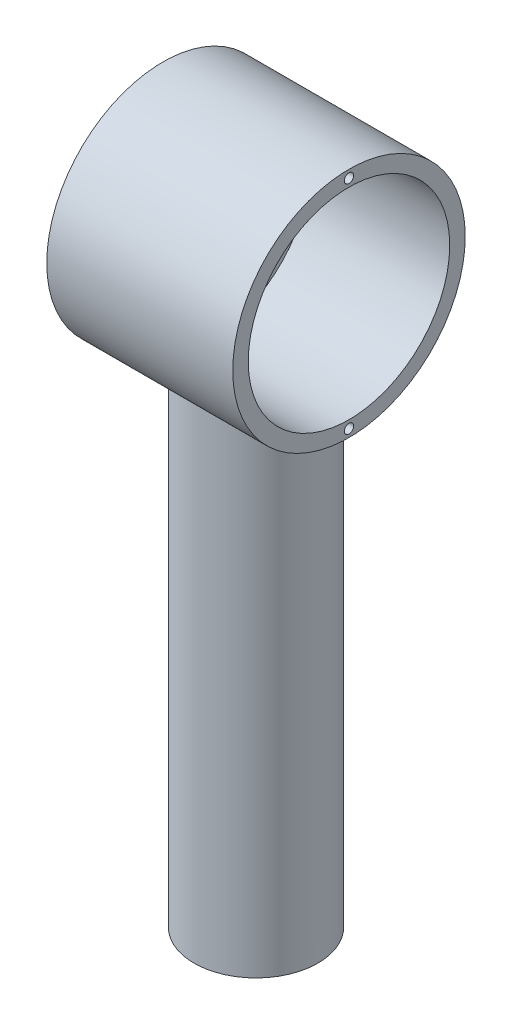
ISO-10303-21;
HEADER;
FILE_DESCRIPTION(('STEP AP214'),'2;1');
FILE_NAME('part.step','',(''),(''),'','','');
FILE_SCHEMA(('AUTOMOTIVE_DESIGN { 1 0 10303 214 1 1 1 1 }'));
ENDSEC;
DATA;
#1=APPLICATION_CONTEXT('core data for automotive mechanical design processes');
#2=APPLICATION_PROTOCOL_DEFINITION('international standard','automotive_design',2000,#1);
#3=PRODUCT_CONTEXT('',#1,'mechanical');
#4=PRODUCT('Part','Part','',(#3));
#5=PRODUCT_RELATED_PRODUCT_CATEGORY('part','',(#4));
#6=PRODUCT_DEFINITION_FORMATION('','',#4);
#7=PRODUCT_DEFINITION_CONTEXT('part definition',#1,'design');
#8=PRODUCT_DEFINITION('design','',#6,#7);
#9=PRODUCT_DEFINITION_SHAPE('','',#8);
#10=(LENGTH_UNIT() NAMED_UNIT(*) SI_UNIT(.MILLI.,.METRE.));
#11=(NAMED_UNIT(*) PLANE_ANGLE_UNIT() SI_UNIT($,.RADIAN.));
#12=(NAMED_UNIT(*) SI_UNIT($,.STERADIAN.) SOLID_ANGLE_UNIT());
#13=UNCERTAINTY_MEASURE_WITH_UNIT(LENGTH_MEASURE(1.E-05),#10,'distance_accuracy_value','');
#14=(GEOMETRIC_REPRESENTATION_CONTEXT(3) GLOBAL_UNCERTAINTY_ASSIGNED_CONTEXT((#13)) GLOBAL_UNIT_ASSIGNED_CONTEXT((#10,
#11,#12)) REPRESENTATION_CONTEXT('',''));
#15=CARTESIAN_POINT('',(0.,0.,0.));
#16=DIRECTION('',(0.,0.,1.));
#17=DIRECTION('',(1.,0.,0.));
#18=AXIS2_PLACEMENT_3D('',#15,#16,#17);
#19=CARTESIAN_POINT('',(30.,39.3347293897193,0.));
#20=DIRECTION('',(-1.,0.,0.));
#21=DIRECTION('',(0.,0.,1.));
#22=AXIS2_PLACEMENT_3D('',#19,#20,#21);
#23=CYLINDRICAL_SURFACE('',#22,37.5);
#24=CARTESIAN_POINT('',(0.,7.61328553859548,-20.));
#25=CARTESIAN_POINT('',(-0.51570182078703,7.6132880699644,-20.0000020694901));
#26=CARTESIAN_POINT('',(-1.03138048086282,7.60066823523603,-19.9800293716016));
#27=CARTESIAN_POINT('',(-2.05864988227541,7.55069636760927,-19.900438433849));
#28=CARTESIAN_POINT('',(-2.57023901293608,7.51333503324412,-19.8408052837619));
#29=CARTESIAN_POINT('',(-3.58588736208425,7.4152585886438,-19.6826321785822));
#30=CARTESIAN_POINT('',(-4.08993349078951,7.35450688776835,-19.5840312579613));
#31=CARTESIAN_POINT('',(-5.08606982289711,7.2119173548362,-19.3492573673804));
#32=CARTESIAN_POINT('',(-5.57816083404603,7.13008095172584,-19.2130869435256));
#33=CARTESIAN_POINT('',(-6.54451950031659,6.94867128669877,-18.9056831081237));
#34=CARTESIAN_POINT('',(-7.01887598033731,6.84920676482473,-18.7346637469901));
#35=CARTESIAN_POINT('',(-7.95042793399519,6.63528396459707,-18.3587310871486));
#36=CARTESIAN_POINT('',(-8.40762317654205,6.52082548443047,-18.1538173322254));
#37=CARTESIAN_POINT('',(-9.30288077314572,6.280113119196,-17.7117378683888));
#38=CARTESIAN_POINT('',(-9.7409430177589,6.15385916666921,-17.4745719750203));
#39=CARTESIAN_POINT('',(-10.5963194801134,5.89274883388715,-16.9695240952738));
#40=CARTESIAN_POINT('',(-11.0136317584403,5.75789165220258,-16.7016392454284));
#41=CARTESIAN_POINT('',(-11.8645739174769,5.46965896243555,-16.1097902433487));
#42=CARTESIAN_POINT('',(-12.2959988155331,5.31574005112918,-15.7829171398827));
#43=CARTESIAN_POINT('',(-13.1302687696288,5.00538236736176,-15.0959577863311));
#44=CARTESIAN_POINT('',(-13.5331236847503,4.84894448725216,-14.7358830932635));
#45=CARTESIAN_POINT('',(-14.3089302194614,4.53718321222723,-13.983797171619));
#46=CARTESIAN_POINT('',(-14.6818598793333,4.38186071053715,-13.5917629081743));
#47=CARTESIAN_POINT('',(-15.3955976257313,4.07610720045685,-12.7776616216099));
#48=CARTESIAN_POINT('',(-15.7364045621611,3.9256763673302,-12.3555935241317));
#49=CARTESIAN_POINT('',(-16.4096071243127,3.62159504628239,-11.4485193546584));
#50=CARTESIAN_POINT('',(-16.7391795739264,3.46863951891845,-10.9611773223788));
#51=CARTESIAN_POINT('',(-17.3557414498559,3.17677022398932,-9.95619250224608));
#52=CARTESIAN_POINT('',(-17.6427280097321,3.03785740183352,-9.43854767799109));
#53=CARTESIAN_POINT('',(-18.1710455089747,2.77814316417008,-8.37643552854965));
#54=CARTESIAN_POINT('',(-18.41240146501,2.65733183222565,-7.83198310803149));
#55=CARTESIAN_POINT('',(-18.8467311540172,2.43738288695592,-6.71989087808538));
#56=CARTESIAN_POINT('',(-19.0397108691608,2.33824259399959,-6.15225394574328));
#57=CARTESIAN_POINT('',(-19.3613843695543,2.17163162893653,-5.04409084493633));
#58=CARTESIAN_POINT('',(-19.4939561926983,2.10227597479069,-4.50497266267378));
#59=CARTESIAN_POINT('',(-19.7140932565086,1.98654763965169,-3.41518253756319));
#60=CARTESIAN_POINT('',(-19.8016606717114,1.9401738482179,-2.86451115428459));
#61=CARTESIAN_POINT('',(-19.9305089797469,1.87178493678521,-1.75660288316389));
#62=CARTESIAN_POINT('',(-19.9718172176824,1.84975542629783,-1.19937007105454));
#63=CARTESIAN_POINT('',(-20.0076218669366,1.83066715768317,-0.0829912230449223));
#64=CARTESIAN_POINT('',(-20.0021216831258,1.83360658330163,0.476154670739197));
#65=CARTESIAN_POINT('',(-19.9472644127489,1.86283417630171,1.53619969533));
#66=CARTESIAN_POINT('',(-19.9022922570022,1.88678776447231,2.03739765283052));
#67=CARTESIAN_POINT('',(-19.7749621587987,1.95430394753898,3.03364583244079));
#68=CARTESIAN_POINT('',(-19.6926072248326,1.99786496446631,3.52869654597525));
#69=CARTESIAN_POINT('',(-19.4914513891179,2.10356816382798,4.50931008296979));
#70=CARTESIAN_POINT('',(-19.3726492483943,2.16571097792434,4.99487258329354));
#71=CARTESIAN_POINT('',(-19.0998645810979,2.30715542449527,5.95344599270102));
#72=CARTESIAN_POINT('',(-18.9458807186661,2.38645770851321,6.42645642441812));
#73=CARTESIAN_POINT('',(-18.6021940192179,2.56151225269992,7.36274655171216));
#74=CARTESIAN_POINT('',(-18.4120876761664,2.65744915384273,7.82584330093237));
#75=CARTESIAN_POINT('',(-17.9990703595971,2.86303540513644,8.73397464778428));
#76=CARTESIAN_POINT('',(-17.7761594997008,2.97268470779299,9.17900930796887));
#77=CARTESIAN_POINT('',(-17.2992035665849,3.20345648806732,10.0490666696836));
#78=CARTESIAN_POINT('',(-17.0451518693495,3.32458140543233,10.4740850868216));
#79=CARTESIAN_POINT('',(-16.5076300698118,3.57587866384264,11.3022971689998));
#80=CARTESIAN_POINT('',(-16.2241573265239,3.70605181675742,11.7054888698094));
#81=CARTESIAN_POINT('',(-15.5985893577811,3.98674568958366,12.5291017597988));
#82=CARTESIAN_POINT('',(-15.2534633423082,4.13797742844741,12.9469820282129));
#83=CARTESIAN_POINT('',(-14.5313798049263,4.44484295747273,13.7525145719855));
#84=CARTESIAN_POINT('',(-14.1544203560153,4.60047701374398,14.1401650146785));
#85=CARTESIAN_POINT('',(-13.3701405977241,4.91262663007434,14.8839378037101));
#86=CARTESIAN_POINT('',(-12.9627935496855,5.06914285172146,15.2400317655331));
#87=CARTESIAN_POINT('',(-12.3307195861961,5.30153569487148,15.7488582454633));
#88=CARTESIAN_POINT('',(-12.116510807287,5.37860595092003,15.9142538119811));
#89=CARTESIAN_POINT('',(-11.681195108966,5.53149327670738,16.2364723560311));
#90=CARTESIAN_POINT('',(-11.460086037774,5.60730994402196,16.3932926166317));
#91=CARTESIAN_POINT('',(-10.7512386458969,5.84397514109671,16.8746465090342));
#92=CARTESIAN_POINT('',(-10.2513083612089,6.00159901702219,17.1830498160679));
#93=CARTESIAN_POINT('',(-9.22309815410546,6.30331720299424,17.7561472395889));
#94=CARTESIAN_POINT('',(-8.69482088095189,6.44741277392444,18.0208454312885));
#95=CARTESIAN_POINT('',(-7.88366626468449,6.64935618490528,18.3830210735658));
#96=CARTESIAN_POINT('',(-7.61021828324999,6.71429172444382,18.497913664606));
#97=CARTESIAN_POINT('',(-7.05750140500056,6.83879429917899,18.715766604051));
#98=CARTESIAN_POINT('',(-6.77823400271512,6.89836269233171,18.8187299725957));
#99=CARTESIAN_POINT('',(-5.93231320321243,7.0680650478359,19.1092351768966));
#100=CARTESIAN_POINT('',(-5.35737558916738,7.16923807530391,19.2784662419717));
#101=CARTESIAN_POINT('',(-4.23790937229369,7.33584327360834,19.553644852043));
#102=CARTESIAN_POINT('',(-3.69469269630252,7.40350754882363,19.6636096891331));
#103=CARTESIAN_POINT('',(-2.59831392694322,7.51172052869058,19.8382645405692));
#104=CARTESIAN_POINT('',(-2.04515244738685,7.55227090100259,19.9029573394163));
#105=CARTESIAN_POINT('',(-0.934456021777517,7.60436975146174,19.985912455731));
#106=CARTESIAN_POINT('',(-0.376925082364807,7.61594224913097,20.0042132273243));
#107=CARTESIAN_POINT('',(0.737521490785031,7.60960405604995,19.9941613677195));
#108=CARTESIAN_POINT('',(1.29443717682133,7.59169610124954,19.9658130658148));
#109=CARTESIAN_POINT('',(2.32861782358089,7.53154939769093,19.8698354015943));
#110=CARTESIAN_POINT('',(2.80663609459942,7.49285872051378,19.807924313161));
#111=CARTESIAN_POINT('',(3.75490327816776,7.39530343572092,19.6502332853426));
#112=CARTESIAN_POINT('',(4.22515302415459,7.33644100713542,19.5544570041705));
#113=CARTESIAN_POINT('',(5.15517852611524,7.20041592332948,19.3301078005834));
#114=CARTESIAN_POINT('',(5.6149510025583,7.12324762206767,19.201524758723));
#115=CARTESIAN_POINT('',(6.52146009102425,6.95292610209488,18.9128757451853));
#116=CARTESIAN_POINT('',(6.9681958338559,6.85977182039513,18.7528076798059));
#117=CARTESIAN_POINT('',(7.86590665438222,6.65563689578103,18.394868382629));
#118=CARTESIAN_POINT('',(8.31620402945305,6.54405241736956,18.1956441409796));
#119=CARTESIAN_POINT('',(9.19863635779434,6.30922572449742,17.7658681503462));
#120=CARTESIAN_POINT('',(9.63076356428131,6.18597860906466,17.5353032131866));
#121=CARTESIAN_POINT('',(10.4751592846687,5.9308834237878,17.0443420482752));
#122=CARTESIAN_POINT('',(10.8874241815632,5.79903379760681,16.7839404160909));
#123=CARTESIAN_POINT('',(11.6906450394737,5.52972993234768,16.234702654998));
#124=CARTESIAN_POINT('',(12.0815992232859,5.39227522750069,15.9458641602208));
#125=CARTESIAN_POINT('',(12.8968327162095,5.09419926730205,15.2964635816017));
#126=CARTESIAN_POINT('',(13.3175400727492,4.93314757086699,14.931603315024));
#127=CARTESIAN_POINT('',(14.1272437684801,4.61166900271007,14.167947195493));
#128=CARTESIAN_POINT('',(14.5162373768361,4.45124218592611,13.7691484261636));
#129=CARTESIAN_POINT('',(15.260632807053,4.13496611295089,12.9392398085584));
#130=CARTESIAN_POINT('',(15.6160178550132,3.97911916902201,12.5081140164347));
#131=CARTESIAN_POINT('',(16.2907536419708,3.67596031043994,11.6156902573406));
#132=CARTESIAN_POINT('',(16.610104394801,3.52864839251033,11.154392301953));
#133=CARTESIAN_POINT('',(17.2229254898073,3.24036680527126,10.183991767619));
#134=CARTESIAN_POINT('',(17.514759715978,3.09991832994598,9.67369760070825));
#135=CARTESIAN_POINT('',(18.0538993037871,2.83626399048115,8.62576948259296));
#136=CARTESIAN_POINT('',(18.3012025928681,2.71305892894344,8.08813426037458));
#137=CARTESIAN_POINT('',(18.7482234390732,2.48763118452518,6.98966501489584));
#138=CARTESIAN_POINT('',(18.9479790657331,2.38539172446142,6.42884997594815));
#139=CARTESIAN_POINT('',(19.297455902112,2.20496544127273,5.28809092848529));
#140=CARTESIAN_POINT('',(19.4471840388594,2.12677528829321,4.70814958051198));
#141=CARTESIAN_POINT('',(19.6821437839116,2.00340406914947,3.59240502635107));
#142=CARTESIAN_POINT('',(19.772289467478,1.95572325345381,3.05790886541163));
#143=CARTESIAN_POINT('',(19.9089530850035,1.88325369864124,1.98183214986327));
#144=CARTESIAN_POINT('',(19.9554739590957,1.85846341679803,1.44025207517587));
#145=CARTESIAN_POINT('',(20.0042303784103,1.83247863443271,0.354749121186357));
#146=CARTESIAN_POINT('',(20.0064830368679,1.83127501576367,-0.189172771475614));
#147=CARTESIAN_POINT('',(19.9667133892609,1.85247557522932,-1.27491994456974));
#148=CARTESIAN_POINT('',(19.924692919087,1.87487877445111,-1.81674531100427));
#149=CARTESIAN_POINT('',(19.8021741343333,1.93989452502643,-2.84994112337194));
#150=CARTESIAN_POINT('',(19.7250802887853,1.98071677905486,-3.34183352060926));
#151=CARTESIAN_POINT('',(19.5349170787364,2.08078402472055,-4.31666546450881));
#152=CARTESIAN_POINT('',(19.4218501893373,2.14002774887424,-4.79960562470527));
#153=CARTESIAN_POINT('',(19.1609304561323,2.2756030999327,-5.75354734954822));
#154=CARTESIAN_POINT('',(19.013075402407,2.35193581240119,-6.22454815364019));
#155=CARTESIAN_POINT('',(18.6840113486702,2.52002741658279,-7.15191066342813));
#156=CARTESIAN_POINT('',(18.5028007591816,2.61178704341008,-7.60827167028258));
#157=CARTESIAN_POINT('',(18.1011724085677,2.81252984845167,-8.52087859171125));
#158=CARTESIAN_POINT('',(17.8795354415977,2.9220313921495,-8.97647337098125));
#159=CARTESIAN_POINT('',(17.4038544118732,3.1532292750963,-9.86715686443598));
#160=CARTESIAN_POINT('',(17.1498098908654,3.27492578678086,-10.302245288535));
#161=CARTESIAN_POINT('',(16.6110188950497,3.52803481329824,-11.1501774118709));
#162=CARTESIAN_POINT('',(16.326263208179,3.65945023966245,-11.5630143806002));
#163=CARTESIAN_POINT('',(15.7278002398746,3.92932914281693,-12.364731365233));
#164=CARTESIAN_POINT('',(15.4140900152394,4.06779333546474,-12.7536089389721));
#165=CARTESIAN_POINT('',(14.7231741657298,4.36454119290665,-13.5475000625257));
#166=CARTESIAN_POINT('',(14.3427819832896,4.52332570635551,-13.9495579337108));
#167=CARTESIAN_POINT('',(13.5503054853644,4.8422779960791,-14.7205601593971));
#168=CARTESIAN_POINT('',(13.1382187825437,5.00244587574532,-15.0895020149462));
#169=CARTESIAN_POINT('',(12.2838013095431,5.32025654018632,-15.7928698949614));
#170=CARTESIAN_POINT('',(11.8414372203949,5.47789629962482,-16.1272568440539));
#171=CARTESIAN_POINT('',(10.928825106116,5.78618549533389,-16.7591408544251));
#172=CARTESIAN_POINT('',(10.4585786781072,5.93683533111324,-17.0566400256525));
#173=CARTESIAN_POINT('',(9.4660459672117,6.23457796367636,-17.6277979510643));
#174=CARTESIAN_POINT('',(8.94232063328413,6.3810371109805,-17.8992953962635));
#175=CARTESIAN_POINT('',(7.86886091086252,6.65599199411329,-18.3964918948525));
#176=CARTESIAN_POINT('',(7.31912211873666,6.78448467386223,-18.6221831595937));
#177=CARTESIAN_POINT('',(6.19886278931986,7.01791071629903,-19.024384907481));
#178=CARTESIAN_POINT('',(5.62840595658142,7.12291019016861,-19.201033745358));
#179=CARTESIAN_POINT('',(4.47007390274586,7.30497875372796,-19.5032386917275));
#180=CARTESIAN_POINT('',(3.88221048468111,7.3820663210496,-19.6288286079236));
#181=CARTESIAN_POINT('',(2.7470780378961,7.49911189520011,-19.8180391560448));
#182=CARTESIAN_POINT('',(2.20083618219898,7.54175781178129,-19.8861700850289));
#183=CARTESIAN_POINT('',(1.10305418721149,7.59884381135044,-19.9771502535946));
#184=CARTESIAN_POINT('',(0.55151384904951,7.61328283143998,-19.9999977867977));
#185=CARTESIAN_POINT('',(0.,7.61328553859548,-20.));
#186=B_SPLINE_CURVE_WITH_KNOTS('',3,(#24,#25,#26,#27,#28,#29,#30,#31,#32,#33,#34,#35,#36,#37,
#38,#39,#40,#41,#42,#43,#44,#45,#46,#47,#48,#49,#50,#51,#52,#53,#54,#55,#56,#57,#58,#59,#60,#61,
#62,#63,#64,#65,#66,#67,#68,#69,#70,#71,#72,#73,#74,#75,#76,#77,#78,#79,#80,#81,#82,#83,#84,#85,
#86,#87,#88,#89,#90,#91,#92,#93,#94,#95,#96,#97,#98,#99,#100,#101,#102,#103,#104,#105,#106,#107,
#108,#109,#110,#111,#112,#113,#114,#115,#116,#117,#118,#119,#120,#121,#122,#123,#124,#125,#126,
#127,#128,#129,#130,#131,#132,#133,#134,#135,#136,#137,#138,#139,#140,#141,#142,#143,#144,#145,
#146,#147,#148,#149,#150,#151,#152,#153,#154,#155,#156,#157,#158,#159,#160,#161,#162,#163,#164,
#165,#166,#167,#168,#169,#170,#171,#172,#173,#174,#175,#176,#177,#178,#179,#180,#181,#182,#183,
#184,#185),.UNSPECIFIED.,.T.,.F.,(4,2,2,2,2,2,2,2,2,2,2,2,2,2,2,2,2,2,2,2,2,2,2,2,2,2,2,2,2,2,2,
2,2,2,2,2,2,2,2,2,2,2,2,2,2,2,2,2,2,2,2,2,2,2,2,2,2,2,2,2,2,2,2,2,2,2,2,2,2,2,2,2,2,2,2,2,2,2,2,
2,4),(0.,1.54653102412566,3.0936437906582,4.6431866763651,6.19262457451161,7.73281777044317,
9.27303169891885,10.8132544364963,12.3536208628203,14.040050545629,15.7258954056102,
17.4129662674639,19.1000975089252,20.9213689398888,22.7427629043674,24.5631553877423,
26.3833226515055,28.059489973695,29.7355762987162,31.4106713180379,33.0856444910623,
34.5951981761441,36.1046303969191,37.6141139345514,39.1236547971856,40.6511712473975,
42.1786824070403,43.7065190516389,45.2344929615787,46.9207293716491,48.6070679294707,
50.2949082420574,51.1388926875629,51.9831430032304,53.8052600800145,55.6272071603968,
56.5377943533881,57.448150505485,59.2683063920866,60.9409458022714,62.6134823260862,
64.2846320385256,65.9556266677268,67.4046488518205,68.853514556278,70.3028277136487,
71.7522372805584,73.2653941231695,74.7791896853173,76.2932598817077,77.8074561511926,
79.544658326591,81.2820099328677,83.0202241182139,84.7584376362927,86.5691871795349,
88.3800209768545,90.189399997079,91.9985283787263,93.628739619584,95.2588409829981,
96.8883121683758,98.5177157865105,100.014703624748,101.511588485983,103.008568462574,
104.505619792595,106.059030766784,107.612463709144,109.166363919111,110.720422255902,
112.445990412954,114.171688673013,115.899317510118,117.626847482728,119.447862072683,
121.269186039717,123.085318370938,124.900246218139,126.554111116078,128.208038334114),.UNSPECIFIED.);
#187=CARTESIAN_POINT('',(0.,7.61328553859548,-20.));
#188=VERTEX_POINT('',#187);
#189=EDGE_CURVE('E12',#188,#188,#186,.T.);
#190=ORIENTED_EDGE('',*,*,#189,.T.);
#191=EDGE_LOOP('',(#190));
#192=FACE_BOUND('',#191,.T.);
#193=CARTESIAN_POINT('',(-30.,39.3347293897193,0.));
#194=DIRECTION('',(1.,0.,0.));
#195=DIRECTION('',(0.,0.,-1.));
#196=AXIS2_PLACEMENT_3D('',#193,#194,#195);
#197=CIRCLE('',#196,37.5);
#198=CARTESIAN_POINT('',(-30.,39.3347293897193,-37.5));
#199=VERTEX_POINT('',#198);
#200=EDGE_CURVE('E122',#199,#199,#197,.T.);
#201=ORIENTED_EDGE('',*,*,#200,.T.);
#202=EDGE_LOOP('',(#201));
#203=FACE_BOUND('',#202,.T.);
#204=CARTESIAN_POINT('',(30.,39.3347293897193,0.));
#205=DIRECTION('',(1.,0.,0.));
#206=DIRECTION('',(0.,0.,-1.));
#207=AXIS2_PLACEMENT_3D('',#204,#205,#206);
#208=CIRCLE('',#207,37.5);
#209=CARTESIAN_POINT('',(30.,39.3347293897193,-37.5));
#210=VERTEX_POINT('',#209);
#211=EDGE_CURVE('E363',#210,#210,#208,.T.);
#212=ORIENTED_EDGE('',*,*,#211,.F.);
#213=EDGE_LOOP('',(#212));
#214=FACE_BOUND('',#213,.T.);
#215=ADVANCED_FACE('F49',(#192,#203,#214),#23,.T.);
#216=CARTESIAN_POINT('',(0.,25.,0.));
#217=DIRECTION('',(0.,-1.,0.));
#218=DIRECTION('',(0.,0.,-1.));
#219=AXIS2_PLACEMENT_3D('',#216,#217,#218);
#220=CYLINDRICAL_SURFACE('',#219,20.);
#221=CARTESIAN_POINT('',(0.,-150.,0.));
#222=DIRECTION('',(0.,-1.,0.));
#223=DIRECTION('',(0.,0.,-1.));
#224=AXIS2_PLACEMENT_3D('',#221,#222,#223);
#225=CIRCLE('',#224,20.);
#226=CARTESIAN_POINT('',(0.,-150.,-20.));
#227=VERTEX_POINT('',#226);
#228=EDGE_CURVE('E145',#227,#227,#225,.T.);
#229=ORIENTED_EDGE('',*,*,#228,.F.);
#230=EDGE_LOOP('',(#229));
#231=FACE_BOUND('',#230,.T.);
#232=ORIENTED_EDGE('',*,*,#189,.F.);
#233=EDGE_LOOP('',(#232));
#234=FACE_BOUND('',#233,.T.);
#235=ADVANCED_FACE('F51',(#231,#234),#220,.T.);
#236=CARTESIAN_POINT('',(12.5,-75.,0.));
#237=DIRECTION('',(1.,0.,0.));
#238=DIRECTION('',(0.,0.,-1.));
#239=AXIS2_PLACEMENT_3D('',#236,#237,#238);
#240=PLANE('',#239);
#241=DIRECTION('',(0.,-1.,0.));
#242=VECTOR('',#241,1.);
#243=CARTESIAN_POINT('',(12.5,-75.,-7.21687836487032));
#244=LINE('',#243,#242);
#245=CARTESIAN_POINT('',(12.5,-75.,-7.21687836487032));
#246=VERTEX_POINT('',#245);
#247=CARTESIAN_POINT('',(12.5,-150.,-7.2168783648703));
#248=VERTEX_POINT('',#247);
#249=EDGE_CURVE('E63',#246,#248,#244,.T.);
#250=ORIENTED_EDGE('',*,*,#249,.T.);
#251=DIRECTION('',(0.,0.,1.));
#252=VECTOR('',#251,1.);
#253=CARTESIAN_POINT('',(12.5,-150.,-7.2168783648703));
#254=LINE('',#253,#252);
#255=CARTESIAN_POINT('',(12.5,-150.,7.21687836487038));
#256=VERTEX_POINT('',#255);
#257=EDGE_CURVE('E127',#248,#256,#254,.T.);
#258=ORIENTED_EDGE('',*,*,#257,.T.);
#259=DIRECTION('',(0.,-1.,0.));
#260=VECTOR('',#259,1.);
#261=CARTESIAN_POINT('',(12.5,-75.,7.21687836487033));
#262=LINE('',#261,#260);
#263=CARTESIAN_POINT('',(12.5,-75.,7.21687836487033));
#264=VERTEX_POINT('',#263);
#265=EDGE_CURVE('E170',#264,#256,#262,.T.);
#266=ORIENTED_EDGE('',*,*,#265,.F.);
#267=DIRECTION('',(0.,0.,1.));
#268=VECTOR('',#267,1.);
#269=CARTESIAN_POINT('',(12.5,-75.,0.));
#270=LINE('',#269,#268);
#271=EDGE_CURVE('E149',#246,#264,#270,.T.);
#272=ORIENTED_EDGE('',*,*,#271,.F.);
#273=EDGE_LOOP('',(#250,#258,#266,#272));
#274=FACE_BOUND('',#273,.T.);
#275=ADVANCED_FACE('F186',(#274),#240,.F.);
#276=CARTESIAN_POINT('',(6.25,-75.,-10.8253175473055));
#277=DIRECTION('',(0.5,0.,-0.866025403784439));
#278=DIRECTION('',(-0.866025403784439,0.,-0.5));
#279=AXIS2_PLACEMENT_3D('',#276,#277,#278);
#280=PLANE('',#279);
#281=DIRECTION('',(0.,-1.,0.));
#282=VECTOR('',#281,1.);
#283=CARTESIAN_POINT('',(0.,-75.,-14.4337567297407));
#284=LINE('',#283,#282);
#285=CARTESIAN_POINT('',(0.,-75.,-14.4337567297407));
#286=VERTEX_POINT('',#285);
#287=CARTESIAN_POINT('',(0.,-150.,-14.4337567297407));
#288=VERTEX_POINT('',#287);
#289=EDGE_CURVE('E77',#286,#288,#284,.T.);
#290=ORIENTED_EDGE('',*,*,#289,.T.);
#291=DIRECTION('',(0.866025403784438,0.,0.500000000000001));
#292=VECTOR('',#291,1.);
#293=CARTESIAN_POINT('',(0.,-150.,-14.4337567297407));
#294=LINE('',#293,#292);
#295=EDGE_CURVE('E108',#288,#248,#294,.T.);
#296=ORIENTED_EDGE('',*,*,#295,.T.);
#297=ORIENTED_EDGE('',*,*,#249,.F.);
#298=DIRECTION('',(0.866025403784439,0.,0.5));
#299=VECTOR('',#298,1.);
#300=CARTESIAN_POINT('',(6.25,-75.,-10.8253175473055));
#301=LINE('',#300,#299);
#302=EDGE_CURVE('E111',#286,#246,#301,.T.);
#303=ORIENTED_EDGE('',*,*,#302,.F.);
#304=EDGE_LOOP('',(#290,#296,#297,#303));
#305=FACE_BOUND('',#304,.T.);
#306=ADVANCED_FACE('F106',(#305),#280,.F.);
#307=CARTESIAN_POINT('',(-6.25000000000001,-75.,-10.8253175473055));
#308=DIRECTION('',(-0.5,0.,-0.866025403784438));
#309=DIRECTION('',(-0.866025403784439,0.,0.5));
#310=AXIS2_PLACEMENT_3D('',#307,#308,#309);
#311=PLANE('',#310);
#312=DIRECTION('',(0.,-1.,0.));
#313=VECTOR('',#312,1.);
#314=CARTESIAN_POINT('',(-12.5,-75.,-7.21687836487032));
#315=LINE('',#314,#313);
#316=CARTESIAN_POINT('',(-12.5,-75.,-7.21687836487032));
#317=VERTEX_POINT('',#316);
#318=CARTESIAN_POINT('',(-12.4999999999999,-150.,-7.21687836487047));
#319=VERTEX_POINT('',#318);
#320=EDGE_CURVE('E113',#317,#319,#315,.T.);
#321=ORIENTED_EDGE('',*,*,#320,.T.);
#322=DIRECTION('',(0.866025403784441,0.,-0.499999999999995));
#323=VECTOR('',#322,1.);
#324=CARTESIAN_POINT('',(-12.4999999999999,-150.,-7.21687836487047));
#325=LINE('',#324,#323);
#326=EDGE_CURVE('E116',#319,#288,#325,.T.);
#327=ORIENTED_EDGE('',*,*,#326,.T.);
#328=ORIENTED_EDGE('',*,*,#289,.F.);
#329=DIRECTION('',(0.866025403784439,0.,-0.5));
#330=VECTOR('',#329,1.);
#331=CARTESIAN_POINT('',(-6.25000000000001,-75.,-10.8253175473055));
#332=LINE('',#331,#330);
#333=EDGE_CURVE('E165',#317,#286,#332,.T.);
#334=ORIENTED_EDGE('',*,*,#333,.F.);
#335=EDGE_LOOP('',(#321,#327,#328,#334));
#336=FACE_BOUND('',#335,.T.);
#337=ADVANCED_FACE('F117',(#336),#311,.F.);
#338=CARTESIAN_POINT('',(-12.5,-75.,0.));
#339=DIRECTION('',(-1.,0.,0.));
#340=DIRECTION('',(0.,0.,1.));
#341=AXIS2_PLACEMENT_3D('',#338,#339,#340);
#342=PLANE('',#341);
#343=DIRECTION('',(0.,-1.,0.));
#344=VECTOR('',#343,1.);
#345=CARTESIAN_POINT('',(-12.5,-75.,7.21687836487033));
#346=LINE('',#345,#344);
#347=CARTESIAN_POINT('',(-12.5,-75.,7.21687836487033));
#348=VERTEX_POINT('',#347);
#349=CARTESIAN_POINT('',(-12.5000000000001,-150.,7.21687836487021));
#350=VERTEX_POINT('',#349);
#351=EDGE_CURVE('E175',#348,#350,#346,.T.);
#352=ORIENTED_EDGE('',*,*,#351,.T.);
#353=DIRECTION('',(0.,0.,-1.));
#354=VECTOR('',#353,1.);
#355=CARTESIAN_POINT('',(-12.5000000000001,-150.,7.21687836487021));
#356=LINE('',#355,#354);
#357=EDGE_CURVE('E142',#350,#319,#356,.T.);
#358=ORIENTED_EDGE('',*,*,#357,.T.);
#359=ORIENTED_EDGE('',*,*,#320,.F.);
#360=DIRECTION('',(0.,0.,-1.));
#361=VECTOR('',#360,1.);
#362=CARTESIAN_POINT('',(-12.5,-75.,0.));
#363=LINE('',#362,#361);
#364=EDGE_CURVE('E161',#348,#317,#363,.T.);
#365=ORIENTED_EDGE('',*,*,#364,.F.);
#366=EDGE_LOOP('',(#352,#358,#359,#365));
#367=FACE_BOUND('',#366,.T.);
#368=ADVANCED_FACE('F194',(#367),#342,.F.);
#369=CARTESIAN_POINT('',(-6.25,-75.,10.8253175473055));
#370=DIRECTION('',(-0.5,0.,0.866025403784439));
#371=DIRECTION('',(0.866025403784439,0.,0.5));
#372=AXIS2_PLACEMENT_3D('',#369,#370,#371);
#373=PLANE('',#372);
#374=DIRECTION('',(0.,-1.,0.));
#375=VECTOR('',#374,1.);
#376=CARTESIAN_POINT('',(0.,-75.,14.4337567297406));
#377=LINE('',#376,#375);
#378=CARTESIAN_POINT('',(0.,-75.,14.4337567297406));
#379=VERTEX_POINT('',#378);
#380=CARTESIAN_POINT('',(0.,-150.,14.4337567297407));
#381=VERTEX_POINT('',#380);
#382=EDGE_CURVE('E178',#379,#381,#377,.T.);
#383=ORIENTED_EDGE('',*,*,#382,.T.);
#384=DIRECTION('',(-0.866025403784435,0.,-0.500000000000007));
#385=VECTOR('',#384,1.);
#386=CARTESIAN_POINT('',(0.,-150.,14.4337567297407));
#387=LINE('',#386,#385);
#388=EDGE_CURVE('E138',#381,#350,#387,.T.);
#389=ORIENTED_EDGE('',*,*,#388,.T.);
#390=ORIENTED_EDGE('',*,*,#351,.F.);
#391=DIRECTION('',(-0.866025403784439,0.,-0.5));
#392=VECTOR('',#391,1.);
#393=CARTESIAN_POINT('',(-6.25,-75.,10.8253175473055));
#394=LINE('',#393,#392);
#395=EDGE_CURVE('E157',#379,#348,#394,.T.);
#396=ORIENTED_EDGE('',*,*,#395,.F.);
#397=EDGE_LOOP('',(#383,#389,#390,#396));
#398=FACE_BOUND('',#397,.T.);
#399=ADVANCED_FACE('F188',(#398),#373,.F.);
#400=CARTESIAN_POINT('',(6.25000000000001,-75.,10.8253175473055));
#401=DIRECTION('',(0.5,0.,0.866025403784439));
#402=DIRECTION('',(0.866025403784439,0.,-0.5));
#403=AXIS2_PLACEMENT_3D('',#400,#401,#402);
#404=PLANE('',#403);
#405=ORIENTED_EDGE('',*,*,#265,.T.);
#406=DIRECTION('',(-0.866025403784441,0.,0.499999999999995));
#407=VECTOR('',#406,1.);
#408=CARTESIAN_POINT('',(12.5,-150.,7.21687836487038));
#409=LINE('',#408,#407);
#410=EDGE_CURVE('E131',#256,#381,#409,.T.);
#411=ORIENTED_EDGE('',*,*,#410,.T.);
#412=ORIENTED_EDGE('',*,*,#382,.F.);
#413=DIRECTION('',(-0.866025403784439,0.,0.5));
#414=VECTOR('',#413,1.);
#415=CARTESIAN_POINT('',(6.25000000000001,-75.,10.8253175473055));
#416=LINE('',#415,#414);
#417=EDGE_CURVE('E153',#264,#379,#416,.T.);
#418=ORIENTED_EDGE('',*,*,#417,.F.);
#419=EDGE_LOOP('',(#405,#411,#412,#418));
#420=FACE_BOUND('',#419,.T.);
#421=ADVANCED_FACE('F183',(#420),#404,.F.);
#422=CARTESIAN_POINT('',(0.,-75.,0.));
#423=DIRECTION('',(0.,-1.,0.));
#424=DIRECTION('',(0.,0.,-1.));
#425=AXIS2_PLACEMENT_3D('',#422,#423,#424);
#426=PLANE('',#425);
#427=ORIENTED_EDGE('',*,*,#271,.T.);
#428=ORIENTED_EDGE('',*,*,#417,.T.);
#429=ORIENTED_EDGE('',*,*,#395,.T.);
#430=ORIENTED_EDGE('',*,*,#364,.T.);
#431=ORIENTED_EDGE('',*,*,#333,.T.);
#432=ORIENTED_EDGE('',*,*,#302,.T.);
#433=EDGE_LOOP('',(#427,#428,#429,#430,#431,#432));
#434=FACE_BOUND('',#433,.T.);
#435=ADVANCED_FACE('F192',(#434),#426,.T.);
#436=CARTESIAN_POINT('',(0.,-150.,0.));
#437=DIRECTION('',(0.,-1.,0.));
#438=DIRECTION('',(0.,0.,-1.));
#439=AXIS2_PLACEMENT_3D('',#436,#437,#438);
#440=PLANE('',#439);
#441=ORIENTED_EDGE('',*,*,#228,.T.);
#442=EDGE_LOOP('',(#441));
#443=FACE_BOUND('',#442,.T.);
#444=ORIENTED_EDGE('',*,*,#295,.F.);
#445=ORIENTED_EDGE('',*,*,#326,.F.);
#446=ORIENTED_EDGE('',*,*,#357,.F.);
#447=ORIENTED_EDGE('',*,*,#388,.F.);
#448=ORIENTED_EDGE('',*,*,#410,.F.);
#449=ORIENTED_EDGE('',*,*,#257,.F.);
#450=EDGE_LOOP('',(#444,#445,#446,#447,#448,#449));
#451=FACE_BOUND('',#450,.T.);
#452=ADVANCED_FACE('F124',(#443,#451),#440,.T.);
#453=CARTESIAN_POINT('',(-30.,39.3347293897193,0.));
#454=DIRECTION('',(1.,0.,0.));
#455=DIRECTION('',(0.,0.,-1.));
#456=AXIS2_PLACEMENT_3D('',#453,#454,#455);
#457=PLANE('',#456);
#458=ORIENTED_EDGE('',*,*,#200,.F.);
#459=EDGE_LOOP('',(#458));
#460=FACE_BOUND('',#459,.T.);
#461=ADVANCED_FACE('F215',(#460),#457,.F.);
#462=CARTESIAN_POINT('',(30.,39.3347293897193,0.));
#463=DIRECTION('',(1.,0.,0.));
#464=DIRECTION('',(0.,0.,-1.));
#465=AXIS2_PLACEMENT_3D('',#462,#463,#464);
#466=PLANE('',#465);
#467=CARTESIAN_POINT('',(30.,74.3347293897193,0.));
#468=DIRECTION('',(1.,0.,0.));
#469=DIRECTION('',(0.,0.,-1.));
#470=AXIS2_PLACEMENT_3D('',#467,#468,#469);
#471=CIRCLE('',#470,1.5);
#472=CARTESIAN_POINT('',(30.,74.3347293897193,-1.5));
#473=VERTEX_POINT('',#472);
#474=EDGE_CURVE('E353',#473,#473,#471,.T.);
#475=ORIENTED_EDGE('',*,*,#474,.F.);
#476=EDGE_LOOP('',(#475));
#477=FACE_BOUND('',#476,.T.);
#478=CARTESIAN_POINT('',(30.,4.33472938971928,0.));
#479=DIRECTION('',(1.,0.,0.));
#480=DIRECTION('',(0.,0.,-1.));
#481=AXIS2_PLACEMENT_3D('',#478,#479,#480);
#482=CIRCLE('',#481,1.5);
#483=CARTESIAN_POINT('',(30.,4.33472938971928,-1.5));
#484=VERTEX_POINT('',#483);
#485=EDGE_CURVE('E345',#484,#484,#482,.T.);
#486=ORIENTED_EDGE('',*,*,#485,.F.);
#487=EDGE_LOOP('',(#486));
#488=FACE_BOUND('',#487,.T.);
#489=CARTESIAN_POINT('',(30.,39.3347293897193,0.));
#490=DIRECTION('',(1.,0.,0.));
#491=DIRECTION('',(0.,0.,-1.));
#492=AXIS2_PLACEMENT_3D('',#489,#490,#491);
#493=CIRCLE('',#492,32.5);
#494=CARTESIAN_POINT('',(30.,39.3347293897193,-32.5));
#495=VERTEX_POINT('',#494);
#496=EDGE_CURVE('E352',#495,#495,#493,.T.);
#497=ORIENTED_EDGE('',*,*,#496,.F.);
#498=EDGE_LOOP('',(#497));
#499=FACE_BOUND('',#498,.T.);
#500=ORIENTED_EDGE('',*,*,#211,.T.);
#501=EDGE_LOOP('',(#500));
#502=FACE_BOUND('',#501,.T.);
#503=ADVANCED_FACE('F243',(#477,#488,#499,#502),#466,.T.);
#504=CARTESIAN_POINT('',(-20.,39.3347293897193,0.));
#505=DIRECTION('',(1.,0.,0.));
#506=DIRECTION('',(0.,0.,-1.));
#507=AXIS2_PLACEMENT_3D('',#504,#505,#506);
#508=CYLINDRICAL_SURFACE('',#507,32.5);
#509=CARTESIAN_POINT('',(-15.,39.3347293897193,0.));
#510=DIRECTION('',(1.,0.,0.));
#511=DIRECTION('',(0.,0.,-1.));
#512=AXIS2_PLACEMENT_3D('',#509,#510,#511);
#513=CIRCLE('',#512,32.5);
#514=CARTESIAN_POINT('',(-15.,39.3347293897193,-32.5));
#515=VERTEX_POINT('',#514);
#516=EDGE_CURVE('E339',#515,#515,#513,.T.);
#517=ORIENTED_EDGE('',*,*,#516,.F.);
#518=EDGE_LOOP('',(#517));
#519=FACE_BOUND('',#518,.T.);
#520=ORIENTED_EDGE('',*,*,#496,.T.);
#521=EDGE_LOOP('',(#520));
#522=FACE_BOUND('',#521,.T.);
#523=ADVANCED_FACE('F264',(#519,#522),#508,.F.);
#524=CARTESIAN_POINT('',(20.,4.33472938971928,0.));
#525=DIRECTION('',(1.,0.,0.));
#526=DIRECTION('',(0.,0.,-1.));
#527=AXIS2_PLACEMENT_3D('',#524,#525,#526);
#528=CYLINDRICAL_SURFACE('',#527,1.5);
#529=CARTESIAN_POINT('',(20.,4.33472938971928,0.));
#530=DIRECTION('',(1.,0.,0.));
#531=DIRECTION('',(0.,0.,-1.));
#532=AXIS2_PLACEMENT_3D('',#529,#530,#531);
#533=CIRCLE('',#532,1.5);
#534=CARTESIAN_POINT('',(20.,4.33472938971928,-1.5));
#535=VERTEX_POINT('',#534);
#536=EDGE_CURVE('E341',#535,#535,#533,.T.);
#537=ORIENTED_EDGE('',*,*,#536,.F.);
#538=EDGE_LOOP('',(#537));
#539=FACE_BOUND('',#538,.T.);
#540=ORIENTED_EDGE('',*,*,#485,.T.);
#541=EDGE_LOOP('',(#540));
#542=FACE_BOUND('',#541,.T.);
#543=ADVANCED_FACE('F272',(#539,#542),#528,.F.);
#544=CARTESIAN_POINT('',(20.,4.33472938971928,0.));
#545=DIRECTION('',(1.,0.,0.));
#546=DIRECTION('',(0.,0.,-1.));
#547=AXIS2_PLACEMENT_3D('',#544,#545,#546);
#548=PLANE('',#547);
#549=ORIENTED_EDGE('',*,*,#536,.T.);
#550=EDGE_LOOP('',(#549));
#551=FACE_BOUND('',#550,.T.);
#552=ADVANCED_FACE('F276',(#551),#548,.T.);
#553=CARTESIAN_POINT('',(20.,74.3347293897193,0.));
#554=DIRECTION('',(1.,0.,0.));
#555=DIRECTION('',(0.,0.,-1.));
#556=AXIS2_PLACEMENT_3D('',#553,#554,#555);
#557=CYLINDRICAL_SURFACE('',#556,1.5);
#558=CARTESIAN_POINT('',(20.,74.3347293897193,0.));
#559=DIRECTION('',(1.,0.,0.));
#560=DIRECTION('',(0.,0.,-1.));
#561=AXIS2_PLACEMENT_3D('',#558,#559,#560);
#562=CIRCLE('',#561,1.5);
#563=CARTESIAN_POINT('',(20.,74.3347293897193,-1.5));
#564=VERTEX_POINT('',#563);
#565=EDGE_CURVE('E348',#564,#564,#562,.T.);
#566=ORIENTED_EDGE('',*,*,#565,.F.);
#567=EDGE_LOOP('',(#566));
#568=FACE_BOUND('',#567,.T.);
#569=ORIENTED_EDGE('',*,*,#474,.T.);
#570=EDGE_LOOP('',(#569));
#571=FACE_BOUND('',#570,.T.);
#572=ADVANCED_FACE('F287',(#568,#571),#557,.F.);
#573=CARTESIAN_POINT('',(20.,74.3347293897193,0.));
#574=DIRECTION('',(1.,0.,0.));
#575=DIRECTION('',(0.,0.,-1.));
#576=AXIS2_PLACEMENT_3D('',#573,#574,#575);
#577=PLANE('',#576);
#578=ORIENTED_EDGE('',*,*,#565,.T.);
#579=EDGE_LOOP('',(#578));
#580=FACE_BOUND('',#579,.T.);
#581=ADVANCED_FACE('F298',(#580),#577,.T.);
#582=CARTESIAN_POINT('',(-15.,39.3347293897193,0.));
#583=DIRECTION('',(1.,0.,0.));
#584=DIRECTION('',(0.,0.,-1.));
#585=AXIS2_PLACEMENT_3D('',#582,#583,#584);
#586=PLANE('',#585);
#587=ORIENTED_EDGE('',*,*,#516,.T.);
#588=EDGE_LOOP('',(#587));
#589=FACE_BOUND('',#588,.T.);
#590=ADVANCED_FACE('F309',(#589),#586,.T.);
#591=CLOSED_SHELL('',(#215,#235,#275,#306,#337,#368,#399,#421,#435,#452,#461,#503,#523,#543,
#552,#572,#581,#590));
#592=MANIFOLD_SOLID_BREP('B2',#591);
#593=ADVANCED_BREP_SHAPE_REPRESENTATION('',(#18,#592),#14);
#594=SHAPE_DEFINITION_REPRESENTATION(#9,#593);
ENDSEC;
END-ISO-10303-21;
